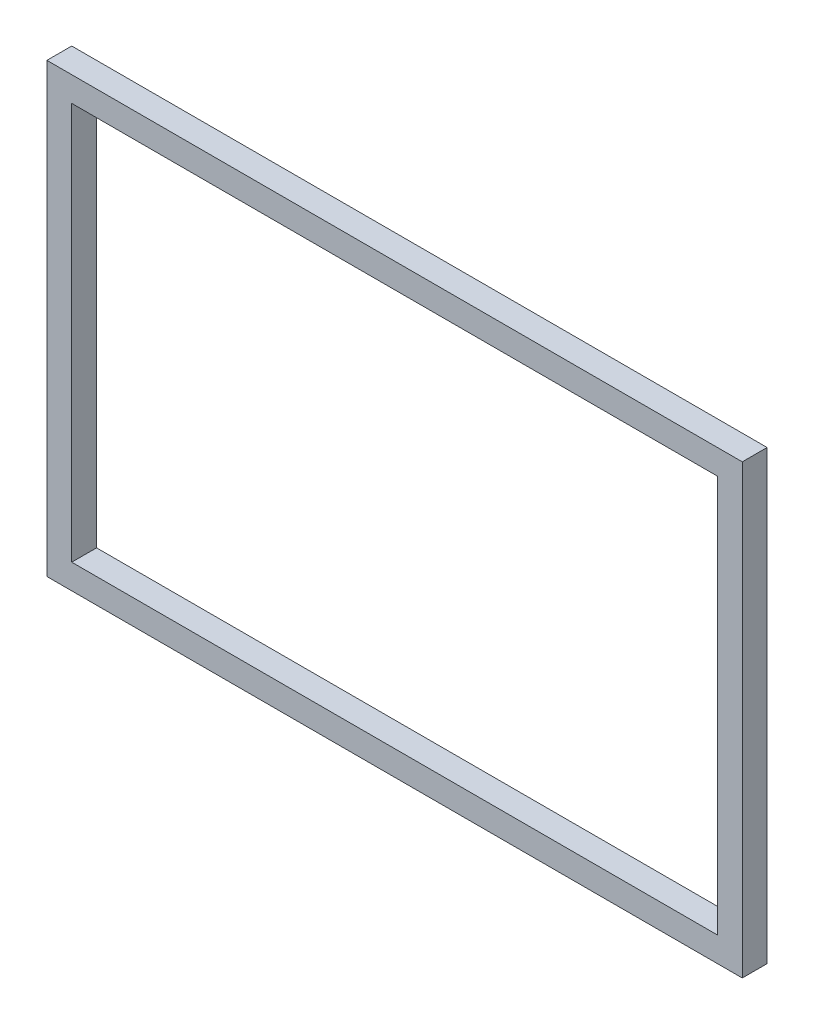
ISO-10303-21;
HEADER;
FILE_DESCRIPTION(('STEP AP214'),'2;1');
FILE_NAME('part.step','',(''),(''),'','','');
FILE_SCHEMA(('AUTOMOTIVE_DESIGN { 1 0 10303 214 1 1 1 1 }'));
ENDSEC;
DATA;
#1=APPLICATION_CONTEXT('core data for automotive mechanical design processes');
#2=APPLICATION_PROTOCOL_DEFINITION('international standard','automotive_design',2000,#1);
#3=PRODUCT_CONTEXT('',#1,'mechanical');
#4=PRODUCT('Part','Part','',(#3));
#5=PRODUCT_RELATED_PRODUCT_CATEGORY('part','',(#4));
#6=PRODUCT_DEFINITION_FORMATION('','',#4);
#7=PRODUCT_DEFINITION_CONTEXT('part definition',#1,'design');
#8=PRODUCT_DEFINITION('design','',#6,#7);
#9=PRODUCT_DEFINITION_SHAPE('','',#8);
#10=(LENGTH_UNIT() NAMED_UNIT(*) SI_UNIT(.MILLI.,.METRE.));
#11=(NAMED_UNIT(*) PLANE_ANGLE_UNIT() SI_UNIT($,.RADIAN.));
#12=(NAMED_UNIT(*) SI_UNIT($,.STERADIAN.) SOLID_ANGLE_UNIT());
#13=UNCERTAINTY_MEASURE_WITH_UNIT(LENGTH_MEASURE(1.E-05),#10,'distance_accuracy_value','');
#14=(GEOMETRIC_REPRESENTATION_CONTEXT(3) GLOBAL_UNCERTAINTY_ASSIGNED_CONTEXT((#13)) GLOBAL_UNIT_ASSIGNED_CONTEXT((#10,
#11,#12)) REPRESENTATION_CONTEXT('',''));
#15=CARTESIAN_POINT('',(0.,0.,0.));
#16=DIRECTION('',(0.,0.,1.));
#17=DIRECTION('',(1.,0.,0.));
#18=AXIS2_PLACEMENT_3D('',#15,#16,#17);
#19=CARTESIAN_POINT('',(0.,0.,10.));
#20=DIRECTION('',(0.,0.,1.));
#21=DIRECTION('',(1.,0.,0.));
#22=AXIS2_PLACEMENT_3D('',#19,#20,#21);
#23=PLANE('',#22);
#24=DIRECTION('',(0.,-1.,0.));
#25=VECTOR('',#24,1.);
#26=CARTESIAN_POINT('',(-47.4444983205798,-153.225765567626,10.));
#27=LINE('',#26,#25);
#28=CARTESIAN_POINT('',(-47.4444983205798,26.774234432374,10.));
#29=VERTEX_POINT('',#28);
#30=CARTESIAN_POINT('',(-47.4444983205798,-153.225765567626,10.));
#31=VERTEX_POINT('',#30);
#32=EDGE_CURVE('E158',#29,#31,#27,.T.);
#33=ORIENTED_EDGE('',*,*,#32,.T.);
#34=DIRECTION('',(1.,0.,0.));
#35=VECTOR('',#34,1.);
#36=CARTESIAN_POINT('',(-47.4444983205798,-153.225765567626,10.));
#37=LINE('',#36,#35);
#38=CARTESIAN_POINT('',(232.55550167942,-153.225765567626,10.));
#39=VERTEX_POINT('',#38);
#40=EDGE_CURVE('E161',#31,#39,#37,.T.);
#41=ORIENTED_EDGE('',*,*,#40,.T.);
#42=DIRECTION('',(0.,1.,0.));
#43=VECTOR('',#42,1.);
#44=CARTESIAN_POINT('',(232.55550167942,-153.225765567626,10.));
#45=LINE('',#44,#43);
#46=CARTESIAN_POINT('',(232.55550167942,26.774234432374,10.));
#47=VERTEX_POINT('',#46);
#48=EDGE_CURVE('E164',#39,#47,#45,.T.);
#49=ORIENTED_EDGE('',*,*,#48,.T.);
#50=DIRECTION('',(-1.,0.,0.));
#51=VECTOR('',#50,1.);
#52=CARTESIAN_POINT('',(-47.4444983205798,26.774234432374,10.));
#53=LINE('',#52,#51);
#54=EDGE_CURVE('E166',#47,#29,#53,.T.);
#55=ORIENTED_EDGE('',*,*,#54,.T.);
#56=EDGE_LOOP('',(#33,#41,#49,#55));
#57=FACE_BOUND('',#56,.T.);
#58=DIRECTION('',(1.,0.,0.));
#59=VECTOR('',#58,1.);
#60=CARTESIAN_POINT('',(0.,-143.225765567626,10.));
#61=LINE('',#60,#59);
#62=CARTESIAN_POINT('',(-37.4444983205798,-143.225765567626,10.));
#63=VERTEX_POINT('',#62);
#64=CARTESIAN_POINT('',(222.55550167942,-143.225765567626,10.));
#65=VERTEX_POINT('',#64);
#66=EDGE_CURVE('E130',#63,#65,#61,.T.);
#67=ORIENTED_EDGE('',*,*,#66,.F.);
#68=DIRECTION('',(0.,-1.,0.));
#69=VECTOR('',#68,1.);
#70=CARTESIAN_POINT('',(-37.4444983205798,0.,10.));
#71=LINE('',#70,#69);
#72=CARTESIAN_POINT('',(-37.4444983205798,16.774234432374,10.));
#73=VERTEX_POINT('',#72);
#74=EDGE_CURVE('E122',#73,#63,#71,.T.);
#75=ORIENTED_EDGE('',*,*,#74,.F.);
#76=DIRECTION('',(-1.,0.,0.));
#77=VECTOR('',#76,1.);
#78=CARTESIAN_POINT('',(0.,16.774234432374,10.));
#79=LINE('',#78,#77);
#80=CARTESIAN_POINT('',(222.55550167942,16.774234432374,10.));
#81=VERTEX_POINT('',#80);
#82=EDGE_CURVE('E144',#81,#73,#79,.T.);
#83=ORIENTED_EDGE('',*,*,#82,.F.);
#84=DIRECTION('',(0.,1.,0.));
#85=VECTOR('',#84,1.);
#86=CARTESIAN_POINT('',(222.55550167942,0.,10.));
#87=LINE('',#86,#85);
#88=EDGE_CURVE('E142',#65,#81,#87,.T.);
#89=ORIENTED_EDGE('',*,*,#88,.F.);
#90=EDGE_LOOP('',(#67,#75,#83,#89));
#91=FACE_BOUND('',#90,.T.);
#92=ADVANCED_FACE('F57',(#57,#91),#23,.T.);
#93=CARTESIAN_POINT('',(0.,0.,0.));
#94=DIRECTION('',(0.,0.,1.));
#95=DIRECTION('',(1.,0.,0.));
#96=AXIS2_PLACEMENT_3D('',#93,#94,#95);
#97=PLANE('',#96);
#98=DIRECTION('',(0.,-1.,0.));
#99=VECTOR('',#98,1.);
#100=CARTESIAN_POINT('',(-47.4444983205798,-153.225765567626,0.));
#101=LINE('',#100,#99);
#102=CARTESIAN_POINT('',(-47.4444983205798,26.774234432374,0.));
#103=VERTEX_POINT('',#102);
#104=CARTESIAN_POINT('',(-47.4444983205798,-153.225765567626,0.));
#105=VERTEX_POINT('',#104);
#106=EDGE_CURVE('E138',#103,#105,#101,.T.);
#107=ORIENTED_EDGE('',*,*,#106,.F.);
#108=DIRECTION('',(-1.,0.,0.));
#109=VECTOR('',#108,1.);
#110=CARTESIAN_POINT('',(-47.4444983205798,26.774234432374,0.));
#111=LINE('',#110,#109);
#112=CARTESIAN_POINT('',(232.55550167942,26.774234432374,0.));
#113=VERTEX_POINT('',#112);
#114=EDGE_CURVE('E162',#113,#103,#111,.T.);
#115=ORIENTED_EDGE('',*,*,#114,.F.);
#116=DIRECTION('',(0.,1.,0.));
#117=VECTOR('',#116,1.);
#118=CARTESIAN_POINT('',(232.55550167942,-153.225765567626,0.));
#119=LINE('',#118,#117);
#120=CARTESIAN_POINT('',(232.55550167942,-153.225765567626,0.));
#121=VERTEX_POINT('',#120);
#122=EDGE_CURVE('E173',#121,#113,#119,.T.);
#123=ORIENTED_EDGE('',*,*,#122,.F.);
#124=DIRECTION('',(1.,0.,0.));
#125=VECTOR('',#124,1.);
#126=CARTESIAN_POINT('',(-47.4444983205798,-153.225765567626,0.));
#127=LINE('',#126,#125);
#128=EDGE_CURVE('E171',#105,#121,#127,.T.);
#129=ORIENTED_EDGE('',*,*,#128,.F.);
#130=EDGE_LOOP('',(#107,#115,#123,#129));
#131=FACE_BOUND('',#130,.T.);
#132=DIRECTION('',(0.,-1.,0.));
#133=VECTOR('',#132,1.);
#134=CARTESIAN_POINT('',(-37.4444983205798,0.,0.));
#135=LINE('',#134,#133);
#136=CARTESIAN_POINT('',(-37.4444983205798,16.774234432374,0.));
#137=VERTEX_POINT('',#136);
#138=CARTESIAN_POINT('',(-37.4444983205798,-143.225765567626,0.));
#139=VERTEX_POINT('',#138);
#140=EDGE_CURVE('E80',#137,#139,#135,.T.);
#141=ORIENTED_EDGE('',*,*,#140,.T.);
#142=DIRECTION('',(1.,0.,0.));
#143=VECTOR('',#142,1.);
#144=CARTESIAN_POINT('',(0.,-143.225765567626,0.));
#145=LINE('',#144,#143);
#146=CARTESIAN_POINT('',(222.55550167942,-143.225765567626,0.));
#147=VERTEX_POINT('',#146);
#148=EDGE_CURVE('E137',#139,#147,#145,.T.);
#149=ORIENTED_EDGE('',*,*,#148,.T.);
#150=DIRECTION('',(0.,1.,0.));
#151=VECTOR('',#150,1.);
#152=CARTESIAN_POINT('',(222.55550167942,0.,0.));
#153=LINE('',#152,#151);
#154=CARTESIAN_POINT('',(222.55550167942,16.774234432374,0.));
#155=VERTEX_POINT('',#154);
#156=EDGE_CURVE('E150',#147,#155,#153,.T.);
#157=ORIENTED_EDGE('',*,*,#156,.T.);
#158=DIRECTION('',(-1.,0.,0.));
#159=VECTOR('',#158,1.);
#160=CARTESIAN_POINT('',(0.,16.774234432374,0.));
#161=LINE('',#160,#159);
#162=EDGE_CURVE('E131',#155,#137,#161,.T.);
#163=ORIENTED_EDGE('',*,*,#162,.T.);
#164=EDGE_LOOP('',(#141,#149,#157,#163));
#165=FACE_BOUND('',#164,.T.);
#166=ADVANCED_FACE('F191',(#131,#165),#97,.F.);
#167=CARTESIAN_POINT('',(-47.4444983205798,-153.225765567626,10.));
#168=DIRECTION('',(1.,0.,0.));
#169=DIRECTION('',(0.,0.,-1.));
#170=AXIS2_PLACEMENT_3D('',#167,#168,#169);
#171=PLANE('',#170);
#172=ORIENTED_EDGE('',*,*,#106,.T.);
#173=DIRECTION('',(0.,0.,-1.));
#174=VECTOR('',#173,1.);
#175=CARTESIAN_POINT('',(-47.4444983205798,-153.225765567626,10.));
#176=LINE('',#175,#174);
#177=EDGE_CURVE('E12',#31,#105,#176,.T.);
#178=ORIENTED_EDGE('',*,*,#177,.F.);
#179=ORIENTED_EDGE('',*,*,#32,.F.);
#180=DIRECTION('',(0.,0.,-1.));
#181=VECTOR('',#180,1.);
#182=CARTESIAN_POINT('',(-47.4444983205798,26.774234432374,10.));
#183=LINE('',#182,#181);
#184=EDGE_CURVE('E168',#29,#103,#183,.T.);
#185=ORIENTED_EDGE('',*,*,#184,.T.);
#186=EDGE_LOOP('',(#172,#178,#179,#185));
#187=FACE_BOUND('',#186,.T.);
#188=ADVANCED_FACE('F59',(#187),#171,.F.);
#189=CARTESIAN_POINT('',(-47.4444983205798,-153.225765567626,10.));
#190=DIRECTION('',(0.,1.,0.));
#191=DIRECTION('',(0.,0.,1.));
#192=AXIS2_PLACEMENT_3D('',#189,#190,#191);
#193=PLANE('',#192);
#194=ORIENTED_EDGE('',*,*,#128,.T.);
#195=DIRECTION('',(0.,0.,-1.));
#196=VECTOR('',#195,1.);
#197=CARTESIAN_POINT('',(232.55550167942,-153.225765567626,10.));
#198=LINE('',#197,#196);
#199=EDGE_CURVE('E65',#39,#121,#198,.T.);
#200=ORIENTED_EDGE('',*,*,#199,.F.);
#201=ORIENTED_EDGE('',*,*,#40,.F.);
#202=ORIENTED_EDGE('',*,*,#177,.T.);
#203=EDGE_LOOP('',(#194,#200,#201,#202));
#204=FACE_BOUND('',#203,.T.);
#205=ADVANCED_FACE('F201',(#204),#193,.F.);
#206=CARTESIAN_POINT('',(232.55550167942,-153.225765567626,10.));
#207=DIRECTION('',(-1.,0.,0.));
#208=DIRECTION('',(0.,0.,1.));
#209=AXIS2_PLACEMENT_3D('',#206,#207,#208);
#210=PLANE('',#209);
#211=ORIENTED_EDGE('',*,*,#122,.T.);
#212=DIRECTION('',(0.,0.,-1.));
#213=VECTOR('',#212,1.);
#214=CARTESIAN_POINT('',(232.55550167942,26.774234432374,10.));
#215=LINE('',#214,#213);
#216=EDGE_CURVE('E178',#47,#113,#215,.T.);
#217=ORIENTED_EDGE('',*,*,#216,.F.);
#218=ORIENTED_EDGE('',*,*,#48,.F.);
#219=ORIENTED_EDGE('',*,*,#199,.T.);
#220=EDGE_LOOP('',(#211,#217,#218,#219));
#221=FACE_BOUND('',#220,.T.);
#222=ADVANCED_FACE('F185',(#221),#210,.F.);
#223=CARTESIAN_POINT('',(-47.4444983205798,26.774234432374,10.));
#224=DIRECTION('',(0.,-1.,0.));
#225=DIRECTION('',(0.,0.,-1.));
#226=AXIS2_PLACEMENT_3D('',#223,#224,#225);
#227=PLANE('',#226);
#228=ORIENTED_EDGE('',*,*,#114,.T.);
#229=ORIENTED_EDGE('',*,*,#184,.F.);
#230=ORIENTED_EDGE('',*,*,#54,.F.);
#231=ORIENTED_EDGE('',*,*,#216,.T.);
#232=EDGE_LOOP('',(#228,#229,#230,#231));
#233=FACE_BOUND('',#232,.T.);
#234=ADVANCED_FACE('F195',(#233),#227,.F.);
#235=CARTESIAN_POINT('',(-37.4444983205798,0.,10.));
#236=DIRECTION('',(1.,0.,0.));
#237=DIRECTION('',(0.,0.,-1.));
#238=AXIS2_PLACEMENT_3D('',#235,#236,#237);
#239=PLANE('',#238);
#240=ORIENTED_EDGE('',*,*,#140,.F.);
#241=DIRECTION('',(0.,0.,-1.));
#242=VECTOR('',#241,1.);
#243=CARTESIAN_POINT('',(-37.4444983205798,16.774234432374,10.));
#244=LINE('',#243,#242);
#245=EDGE_CURVE('E126',#73,#137,#244,.T.);
#246=ORIENTED_EDGE('',*,*,#245,.F.);
#247=ORIENTED_EDGE('',*,*,#74,.T.);
#248=DIRECTION('',(0.,0.,-1.));
#249=VECTOR('',#248,1.);
#250=CARTESIAN_POINT('',(-37.4444983205798,-143.225765567626,10.));
#251=LINE('',#250,#249);
#252=EDGE_CURVE('E125',#63,#139,#251,.T.);
#253=ORIENTED_EDGE('',*,*,#252,.T.);
#254=EDGE_LOOP('',(#240,#246,#247,#253));
#255=FACE_BOUND('',#254,.T.);
#256=ADVANCED_FACE('F124',(#255),#239,.T.);
#257=CARTESIAN_POINT('',(0.,-143.225765567626,10.));
#258=DIRECTION('',(0.,1.,0.));
#259=DIRECTION('',(0.,0.,1.));
#260=AXIS2_PLACEMENT_3D('',#257,#258,#259);
#261=PLANE('',#260);
#262=ORIENTED_EDGE('',*,*,#148,.F.);
#263=ORIENTED_EDGE('',*,*,#252,.F.);
#264=ORIENTED_EDGE('',*,*,#66,.T.);
#265=DIRECTION('',(0.,0.,-1.));
#266=VECTOR('',#265,1.);
#267=CARTESIAN_POINT('',(222.55550167942,-143.225765567626,10.));
#268=LINE('',#267,#266);
#269=EDGE_CURVE('E139',#65,#147,#268,.T.);
#270=ORIENTED_EDGE('',*,*,#269,.T.);
#271=EDGE_LOOP('',(#262,#263,#264,#270));
#272=FACE_BOUND('',#271,.T.);
#273=ADVANCED_FACE('F134',(#272),#261,.T.);
#274=CARTESIAN_POINT('',(222.55550167942,0.,10.));
#275=DIRECTION('',(-1.,0.,0.));
#276=DIRECTION('',(0.,0.,1.));
#277=AXIS2_PLACEMENT_3D('',#274,#275,#276);
#278=PLANE('',#277);
#279=ORIENTED_EDGE('',*,*,#156,.F.);
#280=ORIENTED_EDGE('',*,*,#269,.F.);
#281=ORIENTED_EDGE('',*,*,#88,.T.);
#282=DIRECTION('',(0.,0.,-1.));
#283=VECTOR('',#282,1.);
#284=CARTESIAN_POINT('',(222.55550167942,16.774234432374,10.));
#285=LINE('',#284,#283);
#286=EDGE_CURVE('E72',#81,#155,#285,.T.);
#287=ORIENTED_EDGE('',*,*,#286,.T.);
#288=EDGE_LOOP('',(#279,#280,#281,#287));
#289=FACE_BOUND('',#288,.T.);
#290=ADVANCED_FACE('F224',(#289),#278,.T.);
#291=CARTESIAN_POINT('',(0.,16.774234432374,10.));
#292=DIRECTION('',(0.,-1.,0.));
#293=DIRECTION('',(0.,0.,-1.));
#294=AXIS2_PLACEMENT_3D('',#291,#292,#293);
#295=PLANE('',#294);
#296=ORIENTED_EDGE('',*,*,#162,.F.);
#297=ORIENTED_EDGE('',*,*,#286,.F.);
#298=ORIENTED_EDGE('',*,*,#82,.T.);
#299=ORIENTED_EDGE('',*,*,#245,.T.);
#300=EDGE_LOOP('',(#296,#297,#298,#299));
#301=FACE_BOUND('',#300,.T.);
#302=ADVANCED_FACE('F228',(#301),#295,.T.);
#303=CLOSED_SHELL('',(#92,#166,#188,#205,#222,#234,#256,#273,#290,#302));
#304=MANIFOLD_SOLID_BREP('B2',#303);
#305=ADVANCED_BREP_SHAPE_REPRESENTATION('',(#18,#304),#14);
#306=SHAPE_DEFINITION_REPRESENTATION(#9,#305);
ENDSEC;
END-ISO-10303-21;
